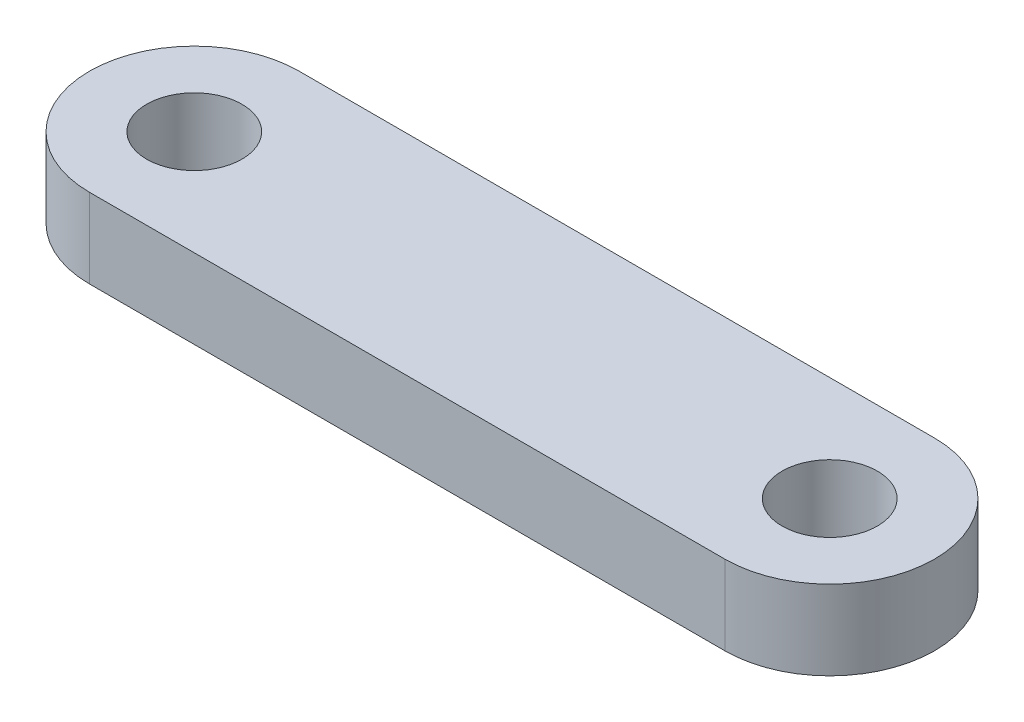
ISO-10303-21;
HEADER;
FILE_DESCRIPTION(('STEP AP214'),'2;1');
FILE_NAME('part.step','',(''),(''),'','','');
FILE_SCHEMA(('AUTOMOTIVE_DESIGN { 1 0 10303 214 1 1 1 1 }'));
ENDSEC;
DATA;
#1=APPLICATION_CONTEXT('core data for automotive mechanical design processes');
#2=APPLICATION_PROTOCOL_DEFINITION('international standard','automotive_design',2000,#1);
#3=PRODUCT_CONTEXT('',#1,'mechanical');
#4=PRODUCT('Part','Part','',(#3));
#5=PRODUCT_RELATED_PRODUCT_CATEGORY('part','',(#4));
#6=PRODUCT_DEFINITION_FORMATION('','',#4);
#7=PRODUCT_DEFINITION_CONTEXT('part definition',#1,'design');
#8=PRODUCT_DEFINITION('design','',#6,#7);
#9=PRODUCT_DEFINITION_SHAPE('','',#8);
#10=(LENGTH_UNIT() NAMED_UNIT(*) SI_UNIT(.MILLI.,.METRE.));
#11=(NAMED_UNIT(*) PLANE_ANGLE_UNIT() SI_UNIT($,.RADIAN.));
#12=(NAMED_UNIT(*) SI_UNIT($,.STERADIAN.) SOLID_ANGLE_UNIT());
#13=UNCERTAINTY_MEASURE_WITH_UNIT(LENGTH_MEASURE(1.E-05),#10,'distance_accuracy_value','');
#14=(GEOMETRIC_REPRESENTATION_CONTEXT(3) GLOBAL_UNCERTAINTY_ASSIGNED_CONTEXT((#13)) GLOBAL_UNIT_ASSIGNED_CONTEXT((#10,
#11,#12)) REPRESENTATION_CONTEXT('',''));
#15=CARTESIAN_POINT('',(0.,0.,0.));
#16=DIRECTION('',(0.,0.,1.));
#17=DIRECTION('',(1.,0.,0.));
#18=AXIS2_PLACEMENT_3D('',#15,#16,#17);
#19=CARTESIAN_POINT('',(0.,12.7,16.764));
#20=DIRECTION('',(0.,0.,-1.));
#21=DIRECTION('',(-1.,0.,0.));
#22=AXIS2_PLACEMENT_3D('',#19,#20,#21);
#23=PLANE('',#22);
#24=DIRECTION('',(1.,0.,0.));
#25=VECTOR('',#24,1.);
#26=CARTESIAN_POINT('',(0.,0.,16.764));
#27=LINE('',#26,#25);
#28=CARTESIAN_POINT('',(0.,0.,16.764));
#29=VERTEX_POINT('',#28);
#30=CARTESIAN_POINT('',(101.6,0.,16.764));
#31=VERTEX_POINT('',#30);
#32=EDGE_CURVE('E117',#29,#31,#27,.T.);
#33=ORIENTED_EDGE('',*,*,#32,.T.);
#34=DIRECTION('',(0.,-1.,0.));
#35=VECTOR('',#34,1.);
#36=CARTESIAN_POINT('',(101.6,12.7,16.764));
#37=LINE('',#36,#35);
#38=CARTESIAN_POINT('',(101.6,12.7,16.764));
#39=VERTEX_POINT('',#38);
#40=EDGE_CURVE('E11',#39,#31,#37,.T.);
#41=ORIENTED_EDGE('',*,*,#40,.F.);
#42=DIRECTION('',(1.,0.,0.));
#43=VECTOR('',#42,1.);
#44=CARTESIAN_POINT('',(0.,12.7,16.764));
#45=LINE('',#44,#43);
#46=CARTESIAN_POINT('',(0.,12.7,16.764));
#47=VERTEX_POINT('',#46);
#48=EDGE_CURVE('E90',#47,#39,#45,.T.);
#49=ORIENTED_EDGE('',*,*,#48,.F.);
#50=DIRECTION('',(0.,-1.,0.));
#51=VECTOR('',#50,1.);
#52=CARTESIAN_POINT('',(0.,12.7,16.764));
#53=LINE('',#52,#51);
#54=EDGE_CURVE('E105',#47,#29,#53,.T.);
#55=ORIENTED_EDGE('',*,*,#54,.T.);
#56=EDGE_LOOP('',(#33,#41,#49,#55));
#57=FACE_BOUND('',#56,.T.);
#58=ADVANCED_FACE('F41',(#57),#23,.F.);
#59=CARTESIAN_POINT('',(101.6,12.7,0.));
#60=DIRECTION('',(0.,-1.,0.));
#61=DIRECTION('',(0.,0.,-1.));
#62=AXIS2_PLACEMENT_3D('',#59,#60,#61);
#63=CYLINDRICAL_SURFACE('',#62,16.764);
#64=CARTESIAN_POINT('',(101.6,0.,0.));
#65=DIRECTION('',(0.,1.,0.));
#66=DIRECTION('',(0.,0.,1.));
#67=AXIS2_PLACEMENT_3D('',#64,#65,#66);
#68=CIRCLE('',#67,16.764);
#69=CARTESIAN_POINT('',(101.6,0.,-16.764));
#70=VERTEX_POINT('',#69);
#71=EDGE_CURVE('E96',#31,#70,#68,.T.);
#72=ORIENTED_EDGE('',*,*,#71,.T.);
#73=DIRECTION('',(0.,-1.,0.));
#74=VECTOR('',#73,1.);
#75=CARTESIAN_POINT('',(101.6,12.7,-16.764));
#76=LINE('',#75,#74);
#77=CARTESIAN_POINT('',(101.6,12.7,-16.764));
#78=VERTEX_POINT('',#77);
#79=EDGE_CURVE('E51',#78,#70,#76,.T.);
#80=ORIENTED_EDGE('',*,*,#79,.F.);
#81=CARTESIAN_POINT('',(101.6,12.7,0.));
#82=DIRECTION('',(0.,1.,0.));
#83=DIRECTION('',(0.,0.,1.));
#84=AXIS2_PLACEMENT_3D('',#81,#82,#83);
#85=CIRCLE('',#84,16.764);
#86=EDGE_CURVE('E85',#39,#78,#85,.T.);
#87=ORIENTED_EDGE('',*,*,#86,.F.);
#88=ORIENTED_EDGE('',*,*,#40,.T.);
#89=EDGE_LOOP('',(#72,#80,#87,#88));
#90=FACE_BOUND('',#89,.T.);
#91=ADVANCED_FACE('F95',(#90),#63,.T.);
#92=CARTESIAN_POINT('',(0.,12.7,-16.764));
#93=DIRECTION('',(0.,0.,-1.));
#94=DIRECTION('',(-1.,0.,0.));
#95=AXIS2_PLACEMENT_3D('',#92,#93,#94);
#96=PLANE('',#95);
#97=DIRECTION('',(1.,0.,0.));
#98=VECTOR('',#97,1.);
#99=CARTESIAN_POINT('',(0.,0.,-16.764));
#100=LINE('',#99,#98);
#101=CARTESIAN_POINT('',(0.,0.,-16.764));
#102=VERTEX_POINT('',#101);
#103=EDGE_CURVE('E123',#102,#70,#100,.T.);
#104=ORIENTED_EDGE('',*,*,#103,.F.);
#105=DIRECTION('',(0.,-1.,0.));
#106=VECTOR('',#105,1.);
#107=CARTESIAN_POINT('',(0.,12.7,-16.764));
#108=LINE('',#107,#106);
#109=CARTESIAN_POINT('',(0.,12.7,-16.764));
#110=VERTEX_POINT('',#109);
#111=EDGE_CURVE('E75',#110,#102,#108,.T.);
#112=ORIENTED_EDGE('',*,*,#111,.F.);
#113=DIRECTION('',(1.,0.,0.));
#114=VECTOR('',#113,1.);
#115=CARTESIAN_POINT('',(0.,12.7,-16.764));
#116=LINE('',#115,#114);
#117=EDGE_CURVE('E88',#110,#78,#116,.T.);
#118=ORIENTED_EDGE('',*,*,#117,.T.);
#119=ORIENTED_EDGE('',*,*,#79,.T.);
#120=EDGE_LOOP('',(#104,#112,#118,#119));
#121=FACE_BOUND('',#120,.T.);
#122=ADVANCED_FACE('F101',(#121),#96,.T.);
#123=CARTESIAN_POINT('',(0.,12.7,0.));
#124=DIRECTION('',(0.,-1.,0.));
#125=DIRECTION('',(0.,0.,-1.));
#126=AXIS2_PLACEMENT_3D('',#123,#124,#125);
#127=CYLINDRICAL_SURFACE('',#126,7.62);
#128=CARTESIAN_POINT('',(0.,12.7,0.));
#129=DIRECTION('',(0.,1.,0.));
#130=DIRECTION('',(0.,0.,1.));
#131=AXIS2_PLACEMENT_3D('',#128,#129,#130);
#132=CIRCLE('',#131,7.62);
#133=CARTESIAN_POINT('',(0.,12.7,7.62));
#134=VERTEX_POINT('',#133);
#135=EDGE_CURVE('E165',#134,#134,#132,.T.);
#136=ORIENTED_EDGE('',*,*,#135,.T.);
#137=EDGE_LOOP('',(#136));
#138=FACE_BOUND('',#137,.T.);
#139=CARTESIAN_POINT('',(0.,0.,0.));
#140=DIRECTION('',(0.,1.,0.));
#141=DIRECTION('',(0.,0.,1.));
#142=AXIS2_PLACEMENT_3D('',#139,#140,#141);
#143=CIRCLE('',#142,7.62);
#144=CARTESIAN_POINT('',(0.,0.,7.62));
#145=VERTEX_POINT('',#144);
#146=EDGE_CURVE('E113',#145,#145,#143,.T.);
#147=ORIENTED_EDGE('',*,*,#146,.F.);
#148=EDGE_LOOP('',(#147));
#149=FACE_BOUND('',#148,.T.);
#150=ADVANCED_FACE('F154',(#138,#149),#127,.F.);
#151=CARTESIAN_POINT('',(101.6,12.7,0.));
#152=DIRECTION('',(0.,-1.,0.));
#153=DIRECTION('',(0.,0.,-1.));
#154=AXIS2_PLACEMENT_3D('',#151,#152,#153);
#155=CYLINDRICAL_SURFACE('',#154,7.62);
#156=CARTESIAN_POINT('',(101.6,12.7,0.));
#157=DIRECTION('',(0.,1.,0.));
#158=DIRECTION('',(0.,0.,1.));
#159=AXIS2_PLACEMENT_3D('',#156,#157,#158);
#160=CIRCLE('',#159,7.62);
#161=CARTESIAN_POINT('',(101.6,12.7,7.62));
#162=VERTEX_POINT('',#161);
#163=EDGE_CURVE('E128',#162,#162,#160,.T.);
#164=ORIENTED_EDGE('',*,*,#163,.T.);
#165=EDGE_LOOP('',(#164));
#166=FACE_BOUND('',#165,.T.);
#167=CARTESIAN_POINT('',(101.6,0.,0.));
#168=DIRECTION('',(0.,1.,0.));
#169=DIRECTION('',(0.,0.,1.));
#170=AXIS2_PLACEMENT_3D('',#167,#168,#169);
#171=CIRCLE('',#170,7.62);
#172=CARTESIAN_POINT('',(101.6,0.,7.62));
#173=VERTEX_POINT('',#172);
#174=EDGE_CURVE('E109',#173,#173,#171,.T.);
#175=ORIENTED_EDGE('',*,*,#174,.F.);
#176=EDGE_LOOP('',(#175));
#177=FACE_BOUND('',#176,.T.);
#178=ADVANCED_FACE('F43',(#166,#177),#155,.F.);
#179=CARTESIAN_POINT('',(0.,12.7,0.));
#180=DIRECTION('',(0.,-1.,0.));
#181=DIRECTION('',(0.,0.,-1.));
#182=AXIS2_PLACEMENT_3D('',#179,#180,#181);
#183=CYLINDRICAL_SURFACE('',#182,16.764);
#184=CARTESIAN_POINT('',(0.,0.,0.));
#185=DIRECTION('',(0.,1.,0.));
#186=DIRECTION('',(0.,0.,1.));
#187=AXIS2_PLACEMENT_3D('',#184,#185,#186);
#188=CIRCLE('',#187,16.764);
#189=EDGE_CURVE('E78',#102,#29,#188,.T.);
#190=ORIENTED_EDGE('',*,*,#189,.T.);
#191=ORIENTED_EDGE('',*,*,#54,.F.);
#192=CARTESIAN_POINT('',(0.,12.7,0.));
#193=DIRECTION('',(0.,1.,0.));
#194=DIRECTION('',(0.,0.,1.));
#195=AXIS2_PLACEMENT_3D('',#192,#193,#194);
#196=CIRCLE('',#195,16.764);
#197=EDGE_CURVE('E59',#110,#47,#196,.T.);
#198=ORIENTED_EDGE('',*,*,#197,.F.);
#199=ORIENTED_EDGE('',*,*,#111,.T.);
#200=EDGE_LOOP('',(#190,#191,#198,#199));
#201=FACE_BOUND('',#200,.T.);
#202=ADVANCED_FACE('F142',(#201),#183,.T.);
#203=CARTESIAN_POINT('',(0.,12.7,0.));
#204=DIRECTION('',(0.,1.,0.));
#205=DIRECTION('',(0.,0.,1.));
#206=AXIS2_PLACEMENT_3D('',#203,#204,#205);
#207=PLANE('',#206);
#208=ORIENTED_EDGE('',*,*,#163,.F.);
#209=EDGE_LOOP('',(#208));
#210=FACE_BOUND('',#209,.T.);
#211=ORIENTED_EDGE('',*,*,#135,.F.);
#212=EDGE_LOOP('',(#211));
#213=FACE_BOUND('',#212,.T.);
#214=ORIENTED_EDGE('',*,*,#48,.T.);
#215=ORIENTED_EDGE('',*,*,#86,.T.);
#216=ORIENTED_EDGE('',*,*,#117,.F.);
#217=ORIENTED_EDGE('',*,*,#197,.T.);
#218=EDGE_LOOP('',(#214,#215,#216,#217));
#219=FACE_BOUND('',#218,.T.);
#220=ADVANCED_FACE('F86',(#210,#213,#219),#207,.T.);
#221=CARTESIAN_POINT('',(0.,0.,0.));
#222=DIRECTION('',(0.,1.,0.));
#223=DIRECTION('',(0.,0.,1.));
#224=AXIS2_PLACEMENT_3D('',#221,#222,#223);
#225=PLANE('',#224);
#226=ORIENTED_EDGE('',*,*,#174,.T.);
#227=EDGE_LOOP('',(#226));
#228=FACE_BOUND('',#227,.T.);
#229=ORIENTED_EDGE('',*,*,#146,.T.);
#230=EDGE_LOOP('',(#229));
#231=FACE_BOUND('',#230,.T.);
#232=ORIENTED_EDGE('',*,*,#32,.F.);
#233=ORIENTED_EDGE('',*,*,#189,.F.);
#234=ORIENTED_EDGE('',*,*,#103,.T.);
#235=ORIENTED_EDGE('',*,*,#71,.F.);
#236=EDGE_LOOP('',(#232,#233,#234,#235));
#237=FACE_BOUND('',#236,.T.);
#238=ADVANCED_FACE('F135',(#228,#231,#237),#225,.F.);
#239=CLOSED_SHELL('',(#58,#91,#122,#150,#178,#202,#220,#238));
#240=MANIFOLD_SOLID_BREP('B2',#239);
#241=ADVANCED_BREP_SHAPE_REPRESENTATION('',(#18,#240),#14);
#242=SHAPE_DEFINITION_REPRESENTATION(#9,#241);
ENDSEC;
END-ISO-10303-21;
